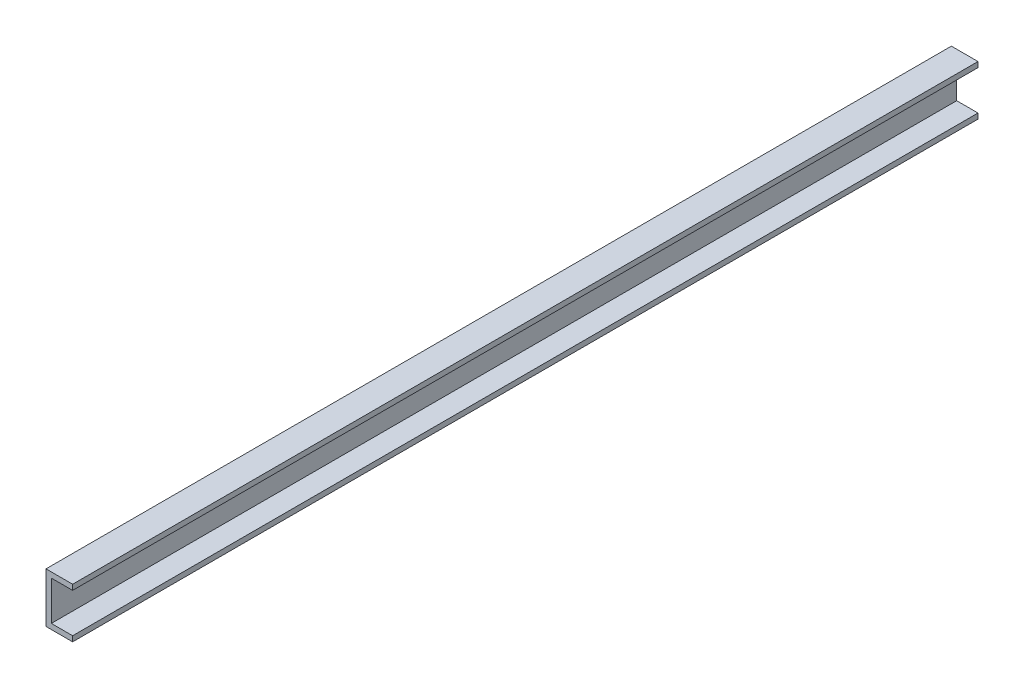
ISO-10303-21;
HEADER;
FILE_DESCRIPTION(('STEP AP214'),'2;1');
FILE_NAME('part.step','',(''),(''),'','','');
FILE_SCHEMA(('AUTOMOTIVE_DESIGN { 1 0 10303 214 1 1 1 1 }'));
ENDSEC;
DATA;
#1=APPLICATION_CONTEXT('core data for automotive mechanical design processes');
#2=APPLICATION_PROTOCOL_DEFINITION('international standard','automotive_design',2000,#1);
#3=PRODUCT_CONTEXT('',#1,'mechanical');
#4=PRODUCT('Part','Part','',(#3));
#5=PRODUCT_RELATED_PRODUCT_CATEGORY('part','',(#4));
#6=PRODUCT_DEFINITION_FORMATION('','',#4);
#7=PRODUCT_DEFINITION_CONTEXT('part definition',#1,'design');
#8=PRODUCT_DEFINITION('design','',#6,#7);
#9=PRODUCT_DEFINITION_SHAPE('','',#8);
#10=(LENGTH_UNIT() NAMED_UNIT(*) SI_UNIT(.MILLI.,.METRE.));
#11=(NAMED_UNIT(*) PLANE_ANGLE_UNIT() SI_UNIT($,.RADIAN.));
#12=(NAMED_UNIT(*) SI_UNIT($,.STERADIAN.) SOLID_ANGLE_UNIT());
#13=UNCERTAINTY_MEASURE_WITH_UNIT(LENGTH_MEASURE(1.E-05),#10,'distance_accuracy_value','');
#14=(GEOMETRIC_REPRESENTATION_CONTEXT(3) GLOBAL_UNCERTAINTY_ASSIGNED_CONTEXT((#13)) GLOBAL_UNIT_ASSIGNED_CONTEXT((#10,
#11,#12)) REPRESENTATION_CONTEXT('',''));
#15=CARTESIAN_POINT('',(0.,0.,0.));
#16=DIRECTION('',(0.,0.,1.));
#17=DIRECTION('',(1.,0.,0.));
#18=AXIS2_PLACEMENT_3D('',#15,#16,#17);
#19=CARTESIAN_POINT('',(40.,0.,1360.));
#20=DIRECTION('',(0.,1.,0.));
#21=DIRECTION('',(-1.,0.,0.));
#22=AXIS2_PLACEMENT_3D('',#19,#20,#21);
#23=PLANE('',#22);
#24=DIRECTION('',(1.,0.,0.));
#25=VECTOR('',#24,1.);
#26=CARTESIAN_POINT('',(40.,0.,0.));
#27=LINE('',#26,#25);
#28=CARTESIAN_POINT('',(0.,0.,0.));
#29=VERTEX_POINT('',#28);
#30=CARTESIAN_POINT('',(40.,0.,0.));
#31=VERTEX_POINT('',#30);
#32=EDGE_CURVE('E134',#29,#31,#27,.T.);
#33=ORIENTED_EDGE('',*,*,#32,.T.);
#34=DIRECTION('',(0.,0.,-1.));
#35=VECTOR('',#34,1.);
#36=CARTESIAN_POINT('',(40.,0.,1360.));
#37=LINE('',#36,#35);
#38=CARTESIAN_POINT('',(40.,0.,1360.));
#39=VERTEX_POINT('',#38);
#40=EDGE_CURVE('E11',#39,#31,#37,.T.);
#41=ORIENTED_EDGE('',*,*,#40,.F.);
#42=DIRECTION('',(1.,0.,0.));
#43=VECTOR('',#42,1.);
#44=CARTESIAN_POINT('',(40.,0.,1360.));
#45=LINE('',#44,#43);
#46=CARTESIAN_POINT('',(0.,0.,1360.));
#47=VERTEX_POINT('',#46);
#48=EDGE_CURVE('E148',#47,#39,#45,.T.);
#49=ORIENTED_EDGE('',*,*,#48,.F.);
#50=DIRECTION('',(0.,0.,-1.));
#51=VECTOR('',#50,1.);
#52=CARTESIAN_POINT('',(0.,0.,1360.));
#53=LINE('',#52,#51);
#54=EDGE_CURVE('E130',#47,#29,#53,.T.);
#55=ORIENTED_EDGE('',*,*,#54,.T.);
#56=EDGE_LOOP('',(#33,#41,#49,#55));
#57=FACE_BOUND('',#56,.T.);
#58=ADVANCED_FACE('F38',(#57),#23,.F.);
#59=CARTESIAN_POINT('',(40.,7.99999999999999,1360.));
#60=DIRECTION('',(-1.,0.,0.));
#61=DIRECTION('',(0.,0.,1.));
#62=AXIS2_PLACEMENT_3D('',#59,#60,#61);
#63=PLANE('',#62);
#64=DIRECTION('',(0.,1.,0.));
#65=VECTOR('',#64,1.);
#66=CARTESIAN_POINT('',(40.,7.99999999999999,0.));
#67=LINE('',#66,#65);
#68=CARTESIAN_POINT('',(40.,7.99999999999999,0.));
#69=VERTEX_POINT('',#68);
#70=EDGE_CURVE('E137',#31,#69,#67,.T.);
#71=ORIENTED_EDGE('',*,*,#70,.T.);
#72=DIRECTION('',(0.,0.,-1.));
#73=VECTOR('',#72,1.);
#74=CARTESIAN_POINT('',(40.,7.99999999999999,1360.));
#75=LINE('',#74,#73);
#76=CARTESIAN_POINT('',(40.,7.99999999999999,1360.));
#77=VERTEX_POINT('',#76);
#78=EDGE_CURVE('E46',#77,#69,#75,.T.);
#79=ORIENTED_EDGE('',*,*,#78,.F.);
#80=DIRECTION('',(0.,1.,0.));
#81=VECTOR('',#80,1.);
#82=CARTESIAN_POINT('',(40.,7.99999999999999,1360.));
#83=LINE('',#82,#81);
#84=EDGE_CURVE('E97',#39,#77,#83,.T.);
#85=ORIENTED_EDGE('',*,*,#84,.F.);
#86=ORIENTED_EDGE('',*,*,#40,.T.);
#87=EDGE_LOOP('',(#71,#79,#85,#86));
#88=FACE_BOUND('',#87,.T.);
#89=ADVANCED_FACE('F183',(#88),#63,.F.);
#90=CARTESIAN_POINT('',(8.00000000000001,8.,1360.));
#91=DIRECTION('',(0.,-1.,0.));
#92=DIRECTION('',(1.,0.,0.));
#93=AXIS2_PLACEMENT_3D('',#90,#91,#92);
#94=PLANE('',#93);
#95=DIRECTION('',(-1.,0.,0.));
#96=VECTOR('',#95,1.);
#97=CARTESIAN_POINT('',(8.00000000000001,8.,0.));
#98=LINE('',#97,#96);
#99=CARTESIAN_POINT('',(8.00000000000001,8.,0.));
#100=VERTEX_POINT('',#99);
#101=EDGE_CURVE('E139',#69,#100,#98,.T.);
#102=ORIENTED_EDGE('',*,*,#101,.T.);
#103=DIRECTION('',(0.,0.,-1.));
#104=VECTOR('',#103,1.);
#105=CARTESIAN_POINT('',(8.00000000000001,8.,1360.));
#106=LINE('',#105,#104);
#107=CARTESIAN_POINT('',(8.00000000000001,8.,1360.));
#108=VERTEX_POINT('',#107);
#109=EDGE_CURVE('E155',#108,#100,#106,.T.);
#110=ORIENTED_EDGE('',*,*,#109,.F.);
#111=DIRECTION('',(-1.,0.,0.));
#112=VECTOR('',#111,1.);
#113=CARTESIAN_POINT('',(8.00000000000001,8.,1360.));
#114=LINE('',#113,#112);
#115=EDGE_CURVE('E163',#77,#108,#114,.T.);
#116=ORIENTED_EDGE('',*,*,#115,.F.);
#117=ORIENTED_EDGE('',*,*,#78,.T.);
#118=EDGE_LOOP('',(#102,#110,#116,#117));
#119=FACE_BOUND('',#118,.T.);
#120=ADVANCED_FACE('F161',(#119),#94,.F.);
#121=CARTESIAN_POINT('',(8.,67.,1360.));
#122=DIRECTION('',(-1.,0.,0.));
#123=DIRECTION('',(0.,-1.,0.));
#124=AXIS2_PLACEMENT_3D('',#121,#122,#123);
#125=PLANE('',#124);
#126=DIRECTION('',(0.,1.,0.));
#127=VECTOR('',#126,1.);
#128=CARTESIAN_POINT('',(8.,67.,0.));
#129=LINE('',#128,#127);
#130=CARTESIAN_POINT('',(8.,67.,0.));
#131=VERTEX_POINT('',#130);
#132=EDGE_CURVE('E141',#100,#131,#129,.T.);
#133=ORIENTED_EDGE('',*,*,#132,.T.);
#134=DIRECTION('',(0.,0.,-1.));
#135=VECTOR('',#134,1.);
#136=CARTESIAN_POINT('',(8.,67.,1360.));
#137=LINE('',#136,#135);
#138=CARTESIAN_POINT('',(8.,67.,1360.));
#139=VERTEX_POINT('',#138);
#140=EDGE_CURVE('E152',#139,#131,#137,.T.);
#141=ORIENTED_EDGE('',*,*,#140,.F.);
#142=DIRECTION('',(0.,1.,0.));
#143=VECTOR('',#142,1.);
#144=CARTESIAN_POINT('',(8.,67.,1360.));
#145=LINE('',#144,#143);
#146=EDGE_CURVE('E175',#108,#139,#145,.T.);
#147=ORIENTED_EDGE('',*,*,#146,.F.);
#148=ORIENTED_EDGE('',*,*,#109,.T.);
#149=EDGE_LOOP('',(#133,#141,#147,#148));
#150=FACE_BOUND('',#149,.T.);
#151=ADVANCED_FACE('F171',(#150),#125,.F.);
#152=CARTESIAN_POINT('',(40.,67.,1360.));
#153=DIRECTION('',(0.,1.,0.));
#154=DIRECTION('',(0.,0.,1.));
#155=AXIS2_PLACEMENT_3D('',#152,#153,#154);
#156=PLANE('',#155);
#157=DIRECTION('',(1.,0.,0.));
#158=VECTOR('',#157,1.);
#159=CARTESIAN_POINT('',(40.,67.,0.));
#160=LINE('',#159,#158);
#161=CARTESIAN_POINT('',(40.,67.,0.));
#162=VERTEX_POINT('',#161);
#163=EDGE_CURVE('E143',#131,#162,#160,.T.);
#164=ORIENTED_EDGE('',*,*,#163,.T.);
#165=DIRECTION('',(0.,0.,-1.));
#166=VECTOR('',#165,1.);
#167=CARTESIAN_POINT('',(40.,67.,1360.));
#168=LINE('',#167,#166);
#169=CARTESIAN_POINT('',(40.,67.,1360.));
#170=VERTEX_POINT('',#169);
#171=EDGE_CURVE('E125',#170,#162,#168,.T.);
#172=ORIENTED_EDGE('',*,*,#171,.F.);
#173=DIRECTION('',(1.,0.,0.));
#174=VECTOR('',#173,1.);
#175=CARTESIAN_POINT('',(40.,67.,1360.));
#176=LINE('',#175,#174);
#177=EDGE_CURVE('E116',#139,#170,#176,.T.);
#178=ORIENTED_EDGE('',*,*,#177,.F.);
#179=ORIENTED_EDGE('',*,*,#140,.T.);
#180=EDGE_LOOP('',(#164,#172,#178,#179));
#181=FACE_BOUND('',#180,.T.);
#182=ADVANCED_FACE('F174',(#181),#156,.F.);
#183=CARTESIAN_POINT('',(40.,75.,1360.));
#184=DIRECTION('',(-1.,0.,0.));
#185=DIRECTION('',(0.,-1.,0.));
#186=AXIS2_PLACEMENT_3D('',#183,#184,#185);
#187=PLANE('',#186);
#188=DIRECTION('',(0.,1.,0.));
#189=VECTOR('',#188,1.);
#190=CARTESIAN_POINT('',(40.,75.,0.));
#191=LINE('',#190,#189);
#192=CARTESIAN_POINT('',(40.,75.,0.));
#193=VERTEX_POINT('',#192);
#194=EDGE_CURVE('E124',#162,#193,#191,.T.);
#195=ORIENTED_EDGE('',*,*,#194,.T.);
#196=DIRECTION('',(0.,0.,-1.));
#197=VECTOR('',#196,1.);
#198=CARTESIAN_POINT('',(40.,75.,1360.));
#199=LINE('',#198,#197);
#200=CARTESIAN_POINT('',(40.,75.,1360.));
#201=VERTEX_POINT('',#200);
#202=EDGE_CURVE('E121',#201,#193,#199,.T.);
#203=ORIENTED_EDGE('',*,*,#202,.F.);
#204=DIRECTION('',(0.,1.,0.));
#205=VECTOR('',#204,1.);
#206=CARTESIAN_POINT('',(40.,75.,1360.));
#207=LINE('',#206,#205);
#208=EDGE_CURVE('E110',#170,#201,#207,.T.);
#209=ORIENTED_EDGE('',*,*,#208,.F.);
#210=ORIENTED_EDGE('',*,*,#171,.T.);
#211=EDGE_LOOP('',(#195,#203,#209,#210));
#212=FACE_BOUND('',#211,.T.);
#213=ADVANCED_FACE('F122',(#212),#187,.F.);
#214=CARTESIAN_POINT('',(0.,75.,1360.));
#215=DIRECTION('',(0.,-1.,0.));
#216=DIRECTION('',(0.,0.,-1.));
#217=AXIS2_PLACEMENT_3D('',#214,#215,#216);
#218=PLANE('',#217);
#219=DIRECTION('',(-1.,0.,0.));
#220=VECTOR('',#219,1.);
#221=CARTESIAN_POINT('',(0.,75.,0.));
#222=LINE('',#221,#220);
#223=CARTESIAN_POINT('',(0.,75.,0.));
#224=VERTEX_POINT('',#223);
#225=EDGE_CURVE('E83',#193,#224,#222,.T.);
#226=ORIENTED_EDGE('',*,*,#225,.T.);
#227=DIRECTION('',(0.,0.,-1.));
#228=VECTOR('',#227,1.);
#229=CARTESIAN_POINT('',(0.,75.,1360.));
#230=LINE('',#229,#228);
#231=CARTESIAN_POINT('',(0.,75.,1360.));
#232=VERTEX_POINT('',#231);
#233=EDGE_CURVE('E126',#232,#224,#230,.T.);
#234=ORIENTED_EDGE('',*,*,#233,.F.);
#235=DIRECTION('',(-1.,0.,0.));
#236=VECTOR('',#235,1.);
#237=CARTESIAN_POINT('',(0.,75.,1360.));
#238=LINE('',#237,#236);
#239=EDGE_CURVE('E114',#201,#232,#238,.T.);
#240=ORIENTED_EDGE('',*,*,#239,.F.);
#241=ORIENTED_EDGE('',*,*,#202,.T.);
#242=EDGE_LOOP('',(#226,#234,#240,#241));
#243=FACE_BOUND('',#242,.T.);
#244=ADVANCED_FACE('F128',(#243),#218,.F.);
#245=CARTESIAN_POINT('',(0.,0.,1360.));
#246=DIRECTION('',(1.,0.,0.));
#247=DIRECTION('',(0.,0.,-1.));
#248=AXIS2_PLACEMENT_3D('',#245,#246,#247);
#249=PLANE('',#248);
#250=DIRECTION('',(0.,-1.,0.));
#251=VECTOR('',#250,1.);
#252=CARTESIAN_POINT('',(0.,0.,0.));
#253=LINE('',#252,#251);
#254=EDGE_CURVE('E89',#224,#29,#253,.T.);
#255=ORIENTED_EDGE('',*,*,#254,.T.);
#256=ORIENTED_EDGE('',*,*,#54,.F.);
#257=DIRECTION('',(0.,-1.,0.));
#258=VECTOR('',#257,1.);
#259=CARTESIAN_POINT('',(0.,0.,1360.));
#260=LINE('',#259,#258);
#261=EDGE_CURVE('E54',#232,#47,#260,.T.);
#262=ORIENTED_EDGE('',*,*,#261,.F.);
#263=ORIENTED_EDGE('',*,*,#233,.T.);
#264=EDGE_LOOP('',(#255,#256,#262,#263));
#265=FACE_BOUND('',#264,.T.);
#266=ADVANCED_FACE('F199',(#265),#249,.F.);
#267=CARTESIAN_POINT('',(0.,0.,1360.));
#268=DIRECTION('',(0.,0.,-1.));
#269=DIRECTION('',(-1.,0.,0.));
#270=AXIS2_PLACEMENT_3D('',#267,#268,#269);
#271=PLANE('',#270);
#272=ORIENTED_EDGE('',*,*,#48,.T.);
#273=ORIENTED_EDGE('',*,*,#84,.T.);
#274=ORIENTED_EDGE('',*,*,#115,.T.);
#275=ORIENTED_EDGE('',*,*,#146,.T.);
#276=ORIENTED_EDGE('',*,*,#177,.T.);
#277=ORIENTED_EDGE('',*,*,#208,.T.);
#278=ORIENTED_EDGE('',*,*,#239,.T.);
#279=ORIENTED_EDGE('',*,*,#261,.T.);
#280=EDGE_LOOP('',(#272,#273,#274,#275,#276,#277,#278,#279));
#281=FACE_BOUND('',#280,.T.);
#282=ADVANCED_FACE('F112',(#281),#271,.F.);
#283=CARTESIAN_POINT('',(0.,0.,0.));
#284=DIRECTION('',(0.,0.,-1.));
#285=DIRECTION('',(-1.,0.,0.));
#286=AXIS2_PLACEMENT_3D('',#283,#284,#285);
#287=PLANE('',#286);
#288=ORIENTED_EDGE('',*,*,#32,.F.);
#289=ORIENTED_EDGE('',*,*,#254,.F.);
#290=ORIENTED_EDGE('',*,*,#225,.F.);
#291=ORIENTED_EDGE('',*,*,#194,.F.);
#292=ORIENTED_EDGE('',*,*,#163,.F.);
#293=ORIENTED_EDGE('',*,*,#132,.F.);
#294=ORIENTED_EDGE('',*,*,#101,.F.);
#295=ORIENTED_EDGE('',*,*,#70,.F.);
#296=EDGE_LOOP('',(#288,#289,#290,#291,#292,#293,#294,#295));
#297=FACE_BOUND('',#296,.T.);
#298=ADVANCED_FACE('F167',(#297),#287,.T.);
#299=CLOSED_SHELL('',(#58,#89,#120,#151,#182,#213,#244,#266,#282,#298));
#300=MANIFOLD_SOLID_BREP('B2',#299);
#301=ADVANCED_BREP_SHAPE_REPRESENTATION('',(#18,#300),#14);
#302=SHAPE_DEFINITION_REPRESENTATION(#9,#301);
ENDSEC;
END-ISO-10303-21;
